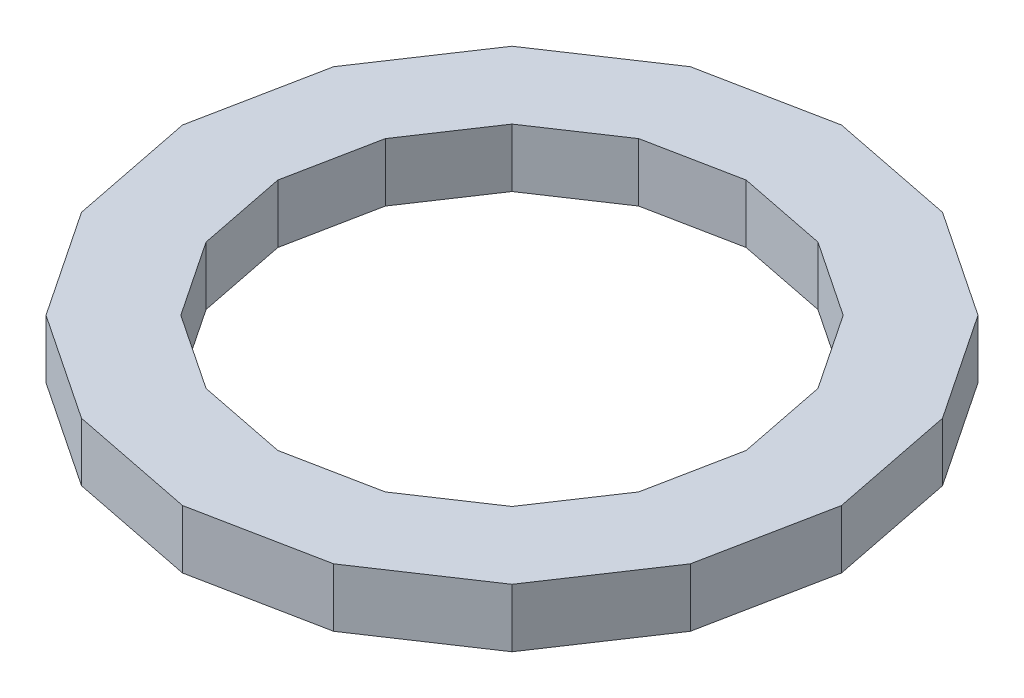
ISO-10303-21;
HEADER;
FILE_DESCRIPTION(('STEP AP214'),'2;1');
FILE_NAME('part.step','',(''),(''),'','','');
FILE_SCHEMA(('AUTOMOTIVE_DESIGN { 1 0 10303 214 1 1 1 1 }'));
ENDSEC;
DATA;
#1=APPLICATION_CONTEXT('core data for automotive mechanical design processes');
#2=APPLICATION_PROTOCOL_DEFINITION('international standard','automotive_design',2000,#1);
#3=PRODUCT_CONTEXT('',#1,'mechanical');
#4=PRODUCT('Part','Part','',(#3));
#5=PRODUCT_RELATED_PRODUCT_CATEGORY('part','',(#4));
#6=PRODUCT_DEFINITION_FORMATION('','',#4);
#7=PRODUCT_DEFINITION_CONTEXT('part definition',#1,'design');
#8=PRODUCT_DEFINITION('design','',#6,#7);
#9=PRODUCT_DEFINITION_SHAPE('','',#8);
#10=(LENGTH_UNIT() NAMED_UNIT(*) SI_UNIT(.MILLI.,.METRE.));
#11=(NAMED_UNIT(*) PLANE_ANGLE_UNIT() SI_UNIT($,.RADIAN.));
#12=(NAMED_UNIT(*) SI_UNIT($,.STERADIAN.) SOLID_ANGLE_UNIT());
#13=UNCERTAINTY_MEASURE_WITH_UNIT(LENGTH_MEASURE(1.E-05),#10,'distance_accuracy_value','');
#14=(GEOMETRIC_REPRESENTATION_CONTEXT(3) GLOBAL_UNCERTAINTY_ASSIGNED_CONTEXT((#13)) GLOBAL_UNIT_ASSIGNED_CONTEXT((#10,
#11,#12)) REPRESENTATION_CONTEXT('',''));
#15=CARTESIAN_POINT('',(0.,0.,0.));
#16=DIRECTION('',(0.,0.,1.));
#17=DIRECTION('',(1.,0.,0.));
#18=AXIS2_PLACEMENT_3D('',#15,#16,#17);
#19=CARTESIAN_POINT('',(0.,19.05,0.));
#20=DIRECTION('',(0.,1.,0.));
#21=DIRECTION('',(0.,0.,1.));
#22=AXIS2_PLACEMENT_3D('',#19,#20,#21);
#23=PLANE('',#22);
#24=DIRECTION('',(0.195090322016117,0.,-0.980785280403233));
#25=VECTOR('',#24,1.);
#26=CARTESIAN_POINT('',(99.2355510191511,19.05,41.1047111016983));
#27=LINE('',#26,#25);
#28=CARTESIAN_POINT('',(99.2355510191511,19.05,41.1047111016983));
#29=VERTEX_POINT('',#28);
#30=CARTESIAN_POINT('',(107.411786414847,19.05,-1.17267698380908E-12));
#31=VERTEX_POINT('',#30);
#32=EDGE_CURVE('E379',#29,#31,#27,.T.);
#33=ORIENTED_EDGE('',*,*,#32,.T.);
#34=DIRECTION('',(-0.195090322016139,0.,-0.980785280403228));
#35=VECTOR('',#34,1.);
#36=CARTESIAN_POINT('',(107.411786414847,19.05,-1.17267698380908E-12));
#37=LINE('',#36,#35);
#38=CARTESIAN_POINT('',(99.2355510191502,19.05,-41.1047111017005));
#39=VERTEX_POINT('',#38);
#40=EDGE_CURVE('E383',#31,#39,#37,.T.);
#41=ORIENTED_EDGE('',*,*,#40,.T.);
#42=DIRECTION('',(-0.555570233019611,0.,-0.831469612302539));
#43=VECTOR('',#42,1.);
#44=CARTESIAN_POINT('',(99.2355510191502,19.05,-41.1047111017005));
#45=LINE('',#44,#43);
#46=CARTESIAN_POINT('',(75.9516025532982,19.05,-75.9516025532999));
#47=VERTEX_POINT('',#46);
#48=EDGE_CURVE('E387',#39,#47,#45,.T.);
#49=ORIENTED_EDGE('',*,*,#48,.T.);
#50=DIRECTION('',(-0.831469612302552,0.,-0.555570233019593));
#51=VECTOR('',#50,1.);
#52=CARTESIAN_POINT('',(75.9516025532982,19.05,-75.9516025532999));
#53=LINE('',#52,#51);
#54=CARTESIAN_POINT('',(41.1047111016984,19.05,-99.235551019151));
#55=VERTEX_POINT('',#54);
#56=EDGE_CURVE('E389',#47,#55,#53,.T.);
#57=ORIENTED_EDGE('',*,*,#56,.T.);
#58=DIRECTION('',(-0.980785280403233,0.,-0.195090322016117));
#59=VECTOR('',#58,1.);
#60=CARTESIAN_POINT('',(41.1047111016984,19.05,-99.235551019151));
#61=LINE('',#60,#59);
#62=CARTESIAN_POINT('',(-1.21550116144787E-12,19.05,-107.411786414846));
#63=VERTEX_POINT('',#62);
#64=EDGE_CURVE('E392',#55,#63,#61,.T.);
#65=ORIENTED_EDGE('',*,*,#64,.T.);
#66=DIRECTION('',(-0.980785280403228,0.,0.195090322016139));
#67=VECTOR('',#66,1.);
#68=CARTESIAN_POINT('',(-1.21550116144787E-12,19.05,-107.411786414846));
#69=LINE('',#68,#67);
#70=CARTESIAN_POINT('',(-41.1047111017005,19.05,-99.2355510191501));
#71=VERTEX_POINT('',#70);
#72=EDGE_CURVE('E394',#63,#71,#69,.T.);
#73=ORIENTED_EDGE('',*,*,#72,.T.);
#74=DIRECTION('',(-0.831469612302539,0.,0.555570233019611));
#75=VECTOR('',#74,1.);
#76=CARTESIAN_POINT('',(-41.1047111017005,19.05,-99.2355510191501));
#77=LINE('',#76,#75);
#78=CARTESIAN_POINT('',(-75.9516025532999,19.05,-75.9516025532982));
#79=VERTEX_POINT('',#78);
#80=EDGE_CURVE('E397',#71,#79,#77,.T.);
#81=ORIENTED_EDGE('',*,*,#80,.T.);
#82=DIRECTION('',(-0.555570233019593,0.,0.831469612302551));
#83=VECTOR('',#82,1.);
#84=CARTESIAN_POINT('',(-75.9516025532999,19.05,-75.9516025532982));
#85=LINE('',#84,#83);
#86=CARTESIAN_POINT('',(-99.235551019151,19.05,-41.1047111016983));
#87=VERTEX_POINT('',#86);
#88=EDGE_CURVE('E400',#79,#87,#85,.T.);
#89=ORIENTED_EDGE('',*,*,#88,.T.);
#90=DIRECTION('',(-0.195090322016117,0.,0.980785280403233));
#91=VECTOR('',#90,1.);
#92=CARTESIAN_POINT('',(-99.235551019151,19.05,-41.1047111016983));
#93=LINE('',#92,#91);
#94=CARTESIAN_POINT('',(-107.411786414846,19.05,1.19130000740411E-12));
#95=VERTEX_POINT('',#94);
#96=EDGE_CURVE('E403',#87,#95,#93,.T.);
#97=ORIENTED_EDGE('',*,*,#96,.T.);
#98=DIRECTION('',(0.195090322016139,0.,0.980785280403228));
#99=VECTOR('',#98,1.);
#100=CARTESIAN_POINT('',(-107.411786414846,19.05,1.19130000740411E-12));
#101=LINE('',#100,#99);
#102=CARTESIAN_POINT('',(-99.2355510191501,19.05,41.1047111017005));
#103=VERTEX_POINT('',#102);
#104=EDGE_CURVE('E406',#95,#103,#101,.T.);
#105=ORIENTED_EDGE('',*,*,#104,.T.);
#106=DIRECTION('',(0.555570233019611,0.,0.831469612302539));
#107=VECTOR('',#106,1.);
#108=CARTESIAN_POINT('',(-99.2355510191501,19.05,41.1047111017005));
#109=LINE('',#108,#107);
#110=CARTESIAN_POINT('',(-75.9516025532982,19.05,75.9516025532999));
#111=VERTEX_POINT('',#110);
#112=EDGE_CURVE('E408',#103,#111,#109,.T.);
#113=ORIENTED_EDGE('',*,*,#112,.T.);
#114=DIRECTION('',(0.831469612302551,0.,0.555570233019593));
#115=VECTOR('',#114,1.);
#116=CARTESIAN_POINT('',(-75.9516025532982,19.05,75.9516025532999));
#117=LINE('',#116,#115);
#118=CARTESIAN_POINT('',(-41.1047111016983,19.05,99.235551019151));
#119=VERTEX_POINT('',#118);
#120=EDGE_CURVE('E410',#111,#119,#117,.T.);
#121=ORIENTED_EDGE('',*,*,#120,.T.);
#122=DIRECTION('',(0.980785280403232,0.,0.195090322016118));
#123=VECTOR('',#122,1.);
#124=CARTESIAN_POINT('',(-41.1047111016983,19.05,99.235551019151));
#125=LINE('',#124,#123);
#126=CARTESIAN_POINT('',(1.18976401131182E-12,19.05,107.411786414847));
#127=VERTEX_POINT('',#126);
#128=EDGE_CURVE('E412',#119,#127,#125,.T.);
#129=ORIENTED_EDGE('',*,*,#128,.T.);
#130=DIRECTION('',(0.980785280403228,0.,-0.195090322016139));
#131=VECTOR('',#130,1.);
#132=CARTESIAN_POINT('',(1.18976401131182E-12,19.05,107.411786414847));
#133=LINE('',#132,#131);
#134=CARTESIAN_POINT('',(41.1047111017005,19.05,99.2355510191502));
#135=VERTEX_POINT('',#134);
#136=EDGE_CURVE('E414',#127,#135,#133,.T.);
#137=ORIENTED_EDGE('',*,*,#136,.T.);
#138=DIRECTION('',(0.831469612302539,0.,-0.555570233019612));
#139=VECTOR('',#138,1.);
#140=CARTESIAN_POINT('',(41.1047111017005,19.05,99.2355510191502));
#141=LINE('',#140,#139);
#142=CARTESIAN_POINT('',(75.9516025532999,19.05,75.9516025532982));
#143=VERTEX_POINT('',#142);
#144=EDGE_CURVE('E416',#135,#143,#141,.T.);
#145=ORIENTED_EDGE('',*,*,#144,.T.);
#146=DIRECTION('',(0.555570233019593,0.,-0.831469612302551));
#147=VECTOR('',#146,1.);
#148=CARTESIAN_POINT('',(75.9516025532999,19.05,75.9516025532982));
#149=LINE('',#148,#147);
#150=EDGE_CURVE('E419',#143,#29,#149,.T.);
#151=ORIENTED_EDGE('',*,*,#150,.T.);
#152=EDGE_LOOP('',(#33,#41,#49,#57,#65,#73,#81,#89,#97,#105,#113,#121,#129,#137,#145,#151));
#153=FACE_BOUND('',#152,.T.);
#154=DIRECTION('',(-0.195090322016139,0.,-0.980785280403228));
#155=VECTOR('',#154,1.);
#156=CARTESIAN_POINT('',(76.334647912657,19.05,-8.61618793245147E-13));
#157=LINE('',#156,#155);
#158=CARTESIAN_POINT('',(76.334647912657,19.05,-8.61618793245147E-13));
#159=VERTEX_POINT('',#158);
#160=CARTESIAN_POINT('',(70.5240188279589,19.05,-29.212005071597));
#161=VERTEX_POINT('',#160);
#162=EDGE_CURVE('E252',#159,#161,#157,.T.);
#163=ORIENTED_EDGE('',*,*,#162,.F.);
#164=DIRECTION('',(0.195090322016117,0.,-0.980785280403233));
#165=VECTOR('',#164,1.);
#166=CARTESIAN_POINT('',(70.5240188279595,19.05,29.2120050715954));
#167=LINE('',#166,#165);
#168=CARTESIAN_POINT('',(70.5240188279595,19.05,29.2120050715954));
#169=VERTEX_POINT('',#168);
#170=EDGE_CURVE('E243',#169,#159,#167,.T.);
#171=ORIENTED_EDGE('',*,*,#170,.F.);
#172=DIRECTION('',(0.555570233019593,0.,-0.831469612302551));
#173=VECTOR('',#172,1.);
#174=CARTESIAN_POINT('',(53.9767471785279,19.05,53.9767471785267));
#175=LINE('',#174,#173);
#176=CARTESIAN_POINT('',(53.9767471785279,19.05,53.9767471785267));
#177=VERTEX_POINT('',#176);
#178=EDGE_CURVE('E301',#177,#169,#175,.T.);
#179=ORIENTED_EDGE('',*,*,#178,.F.);
#180=DIRECTION('',(0.831469612302539,0.,-0.555570233019612));
#181=VECTOR('',#180,1.);
#182=CARTESIAN_POINT('',(29.212005071597,19.05,70.5240188279589));
#183=LINE('',#182,#181);
#184=CARTESIAN_POINT('',(29.212005071597,19.05,70.5240188279589));
#185=VERTEX_POINT('',#184);
#186=EDGE_CURVE('E299',#185,#177,#183,.T.);
#187=ORIENTED_EDGE('',*,*,#186,.F.);
#188=DIRECTION('',(0.980785280403228,0.,-0.195090322016139));
#189=VECTOR('',#188,1.);
#190=CARTESIAN_POINT('',(7.92738908590214E-13,19.05,76.334647912657));
#191=LINE('',#190,#189);
#192=CARTESIAN_POINT('',(7.92738908590214E-13,19.05,76.334647912657));
#193=VERTEX_POINT('',#192);
#194=EDGE_CURVE('E297',#193,#185,#191,.T.);
#195=ORIENTED_EDGE('',*,*,#194,.F.);
#196=DIRECTION('',(0.980785280403233,0.,0.195090322016117));
#197=VECTOR('',#196,1.);
#198=CARTESIAN_POINT('',(-29.2120050715954,19.05,70.5240188279596));
#199=LINE('',#198,#197);
#200=CARTESIAN_POINT('',(-29.2120050715954,19.05,70.5240188279596));
#201=VERTEX_POINT('',#200);
#202=EDGE_CURVE('E295',#201,#193,#199,.T.);
#203=ORIENTED_EDGE('',*,*,#202,.F.);
#204=DIRECTION('',(0.831469612302551,0.,0.555570233019593));
#205=VECTOR('',#204,1.);
#206=CARTESIAN_POINT('',(-53.9767471785267,19.05,53.9767471785279));
#207=LINE('',#206,#205);
#208=CARTESIAN_POINT('',(-53.9767471785267,19.05,53.9767471785279));
#209=VERTEX_POINT('',#208);
#210=EDGE_CURVE('E293',#209,#201,#207,.T.);
#211=ORIENTED_EDGE('',*,*,#210,.F.);
#212=DIRECTION('',(0.555570233019612,0.,0.831469612302539));
#213=VECTOR('',#212,1.);
#214=CARTESIAN_POINT('',(-70.5240188279589,19.05,29.212005071597));
#215=LINE('',#214,#213);
#216=CARTESIAN_POINT('',(-70.5240188279589,19.05,29.212005071597));
#217=VERTEX_POINT('',#216);
#218=EDGE_CURVE('E291',#217,#209,#215,.T.);
#219=ORIENTED_EDGE('',*,*,#218,.F.);
#220=DIRECTION('',(0.195090322016139,0.,0.980785280403228));
#221=VECTOR('',#220,1.);
#222=CARTESIAN_POINT('',(-76.334647912657,19.05,8.32302934409206E-13));
#223=LINE('',#222,#221);
#224=CARTESIAN_POINT('',(-76.334647912657,19.05,8.32302934409206E-13));
#225=VERTEX_POINT('',#224);
#226=EDGE_CURVE('E289',#225,#217,#223,.T.);
#227=ORIENTED_EDGE('',*,*,#226,.F.);
#228=DIRECTION('',(-0.195090322016117,0.,0.980785280403233));
#229=VECTOR('',#228,1.);
#230=CARTESIAN_POINT('',(-70.5240188279595,19.05,-29.2120050715954));
#231=LINE('',#230,#229);
#232=CARTESIAN_POINT('',(-70.5240188279595,19.05,-29.2120050715954));
#233=VERTEX_POINT('',#232);
#234=EDGE_CURVE('E287',#233,#225,#231,.T.);
#235=ORIENTED_EDGE('',*,*,#234,.F.);
#236=DIRECTION('',(-0.555570233019593,0.,0.831469612302551));
#237=VECTOR('',#236,1.);
#238=CARTESIAN_POINT('',(-53.9767471785279,19.05,-53.9767471785267));
#239=LINE('',#238,#237);
#240=CARTESIAN_POINT('',(-53.9767471785279,19.05,-53.9767471785267));
#241=VERTEX_POINT('',#240);
#242=EDGE_CURVE('E284',#241,#233,#239,.T.);
#243=ORIENTED_EDGE('',*,*,#242,.F.);
#244=DIRECTION('',(-0.831469612302539,0.,0.555570233019612));
#245=VECTOR('',#244,1.);
#246=CARTESIAN_POINT('',(-29.212005071597,19.05,-70.5240188279589));
#247=LINE('',#246,#245);
#248=CARTESIAN_POINT('',(-29.212005071597,19.05,-70.5240188279589));
#249=VERTEX_POINT('',#248);
#250=EDGE_CURVE('E281',#249,#241,#247,.T.);
#251=ORIENTED_EDGE('',*,*,#250,.F.);
#252=DIRECTION('',(-0.980785280403228,0.,0.195090322016139));
#253=VECTOR('',#252,1.);
#254=CARTESIAN_POINT('',(-8.94551034685109E-13,19.05,-76.3346479126569));
#255=LINE('',#254,#253);
#256=CARTESIAN_POINT('',(-8.94551034685109E-13,19.05,-76.3346479126569));
#257=VERTEX_POINT('',#256);
#258=EDGE_CURVE('E279',#257,#249,#255,.T.);
#259=ORIENTED_EDGE('',*,*,#258,.F.);
#260=DIRECTION('',(-0.980785280403233,0.,-0.195090322016117));
#261=VECTOR('',#260,1.);
#262=CARTESIAN_POINT('',(29.2120050715955,19.05,-70.5240188279595));
#263=LINE('',#262,#261);
#264=CARTESIAN_POINT('',(29.2120050715955,19.05,-70.5240188279595));
#265=VERTEX_POINT('',#264);
#266=EDGE_CURVE('E276',#265,#257,#263,.T.);
#267=ORIENTED_EDGE('',*,*,#266,.F.);
#268=DIRECTION('',(-0.831469612302552,0.,-0.555570233019593));
#269=VECTOR('',#268,1.);
#270=CARTESIAN_POINT('',(53.9767471785267,19.05,-53.9767471785279));
#271=LINE('',#270,#269);
#272=CARTESIAN_POINT('',(53.9767471785267,19.05,-53.9767471785279));
#273=VERTEX_POINT('',#272);
#274=EDGE_CURVE('E272',#273,#265,#271,.T.);
#275=ORIENTED_EDGE('',*,*,#274,.F.);
#276=DIRECTION('',(-0.555570233019611,0.,-0.831469612302539));
#277=VECTOR('',#276,1.);
#278=CARTESIAN_POINT('',(70.5240188279589,19.05,-29.212005071597));
#279=LINE('',#278,#277);
#280=EDGE_CURVE('E265',#161,#273,#279,.T.);
#281=ORIENTED_EDGE('',*,*,#280,.F.);
#282=EDGE_LOOP('',(#163,#171,#179,#187,#195,#203,#211,#219,#227,#235,#243,#251,#259,#267,#275,#281));
#283=FACE_BOUND('',#282,.T.);
#284=ADVANCED_FACE('F34',(#153,#283),#23,.T.);
#285=CARTESIAN_POINT('',(0.,0.,0.));
#286=DIRECTION('',(0.,1.,0.));
#287=DIRECTION('',(0.,0.,1.));
#288=AXIS2_PLACEMENT_3D('',#285,#286,#287);
#289=PLANE('',#288);
#290=DIRECTION('',(0.195090322016117,0.,-0.980785280403233));
#291=VECTOR('',#290,1.);
#292=CARTESIAN_POINT('',(99.2355510191511,0.,41.1047111016983));
#293=LINE('',#292,#291);
#294=CARTESIAN_POINT('',(99.2355510191511,0.,41.1047111016983));
#295=VERTEX_POINT('',#294);
#296=CARTESIAN_POINT('',(107.411786414847,0.,-1.17267698380908E-12));
#297=VERTEX_POINT('',#296);
#298=EDGE_CURVE('E260',#295,#297,#293,.T.);
#299=ORIENTED_EDGE('',*,*,#298,.F.);
#300=DIRECTION('',(0.555570233019593,0.,-0.831469612302551));
#301=VECTOR('',#300,1.);
#302=CARTESIAN_POINT('',(75.9516025532999,0.,75.9516025532982));
#303=LINE('',#302,#301);
#304=CARTESIAN_POINT('',(75.9516025532999,0.,75.9516025532982));
#305=VERTEX_POINT('',#304);
#306=EDGE_CURVE('E384',#305,#295,#303,.T.);
#307=ORIENTED_EDGE('',*,*,#306,.F.);
#308=DIRECTION('',(0.831469612302539,0.,-0.555570233019612));
#309=VECTOR('',#308,1.);
#310=CARTESIAN_POINT('',(41.1047111017005,0.,99.2355510191502));
#311=LINE('',#310,#309);
#312=CARTESIAN_POINT('',(41.1047111017005,0.,99.2355510191502));
#313=VERTEX_POINT('',#312);
#314=EDGE_CURVE('E455',#313,#305,#311,.T.);
#315=ORIENTED_EDGE('',*,*,#314,.F.);
#316=DIRECTION('',(0.980785280403228,0.,-0.195090322016139));
#317=VECTOR('',#316,1.);
#318=CARTESIAN_POINT('',(1.18976401131182E-12,0.,107.411786414847));
#319=LINE('',#318,#317);
#320=CARTESIAN_POINT('',(1.18976401131182E-12,0.,107.411786414847));
#321=VERTEX_POINT('',#320);
#322=EDGE_CURVE('E453',#321,#313,#319,.T.);
#323=ORIENTED_EDGE('',*,*,#322,.F.);
#324=DIRECTION('',(0.980785280403232,0.,0.195090322016118));
#325=VECTOR('',#324,1.);
#326=CARTESIAN_POINT('',(-41.1047111016983,0.,99.235551019151));
#327=LINE('',#326,#325);
#328=CARTESIAN_POINT('',(-41.1047111016983,0.,99.235551019151));
#329=VERTEX_POINT('',#328);
#330=EDGE_CURVE('E450',#329,#321,#327,.T.);
#331=ORIENTED_EDGE('',*,*,#330,.F.);
#332=DIRECTION('',(0.831469612302551,0.,0.555570233019593));
#333=VECTOR('',#332,1.);
#334=CARTESIAN_POINT('',(-75.9516025532982,0.,75.9516025532999));
#335=LINE('',#334,#333);
#336=CARTESIAN_POINT('',(-75.9516025532982,0.,75.9516025532999));
#337=VERTEX_POINT('',#336);
#338=EDGE_CURVE('E447',#337,#329,#335,.T.);
#339=ORIENTED_EDGE('',*,*,#338,.F.);
#340=DIRECTION('',(0.555570233019611,0.,0.831469612302539));
#341=VECTOR('',#340,1.);
#342=CARTESIAN_POINT('',(-99.2355510191501,0.,41.1047111017005));
#343=LINE('',#342,#341);
#344=CARTESIAN_POINT('',(-99.2355510191501,0.,41.1047111017005));
#345=VERTEX_POINT('',#344);
#346=EDGE_CURVE('E444',#345,#337,#343,.T.);
#347=ORIENTED_EDGE('',*,*,#346,.F.);
#348=DIRECTION('',(0.195090322016139,0.,0.980785280403228));
#349=VECTOR('',#348,1.);
#350=CARTESIAN_POINT('',(-107.411786414846,0.,1.19130000740411E-12));
#351=LINE('',#350,#349);
#352=CARTESIAN_POINT('',(-107.411786414846,0.,1.19130000740411E-12));
#353=VERTEX_POINT('',#352);
#354=EDGE_CURVE('E442',#353,#345,#351,.T.);
#355=ORIENTED_EDGE('',*,*,#354,.F.);
#356=DIRECTION('',(-0.195090322016117,0.,0.980785280403233));
#357=VECTOR('',#356,1.);
#358=CARTESIAN_POINT('',(-99.235551019151,0.,-41.1047111016983));
#359=LINE('',#358,#357);
#360=CARTESIAN_POINT('',(-99.235551019151,0.,-41.1047111016983));
#361=VERTEX_POINT('',#360);
#362=EDGE_CURVE('E440',#361,#353,#359,.T.);
#363=ORIENTED_EDGE('',*,*,#362,.F.);
#364=DIRECTION('',(-0.555570233019593,0.,0.831469612302551));
#365=VECTOR('',#364,1.);
#366=CARTESIAN_POINT('',(-75.9516025532999,0.,-75.9516025532982));
#367=LINE('',#366,#365);
#368=CARTESIAN_POINT('',(-75.9516025532999,0.,-75.9516025532982));
#369=VERTEX_POINT('',#368);
#370=EDGE_CURVE('E437',#369,#361,#367,.T.);
#371=ORIENTED_EDGE('',*,*,#370,.F.);
#372=DIRECTION('',(-0.831469612302539,0.,0.555570233019611));
#373=VECTOR('',#372,1.);
#374=CARTESIAN_POINT('',(-41.1047111017005,0.,-99.2355510191501));
#375=LINE('',#374,#373);
#376=CARTESIAN_POINT('',(-41.1047111017005,0.,-99.2355510191501));
#377=VERTEX_POINT('',#376);
#378=EDGE_CURVE('E435',#377,#369,#375,.T.);
#379=ORIENTED_EDGE('',*,*,#378,.F.);
#380=DIRECTION('',(-0.980785280403228,0.,0.195090322016139));
#381=VECTOR('',#380,1.);
#382=CARTESIAN_POINT('',(-1.21550116144787E-12,0.,-107.411786414846));
#383=LINE('',#382,#381);
#384=CARTESIAN_POINT('',(-1.21550116144787E-12,0.,-107.411786414846));
#385=VERTEX_POINT('',#384);
#386=EDGE_CURVE('E433',#385,#377,#383,.T.);
#387=ORIENTED_EDGE('',*,*,#386,.F.);
#388=DIRECTION('',(-0.980785280403233,0.,-0.195090322016117));
#389=VECTOR('',#388,1.);
#390=CARTESIAN_POINT('',(41.1047111016984,0.,-99.235551019151));
#391=LINE('',#390,#389);
#392=CARTESIAN_POINT('',(41.1047111016984,0.,-99.235551019151));
#393=VERTEX_POINT('',#392);
#394=EDGE_CURVE('E431',#393,#385,#391,.T.);
#395=ORIENTED_EDGE('',*,*,#394,.F.);
#396=DIRECTION('',(-0.831469612302552,0.,-0.555570233019593));
#397=VECTOR('',#396,1.);
#398=CARTESIAN_POINT('',(75.9516025532982,0.,-75.9516025532999));
#399=LINE('',#398,#397);
#400=CARTESIAN_POINT('',(75.9516025532982,0.,-75.9516025532999));
#401=VERTEX_POINT('',#400);
#402=EDGE_CURVE('E429',#401,#393,#399,.T.);
#403=ORIENTED_EDGE('',*,*,#402,.F.);
#404=DIRECTION('',(-0.555570233019611,0.,-0.831469612302539));
#405=VECTOR('',#404,1.);
#406=CARTESIAN_POINT('',(99.2355510191502,0.,-41.1047111017005));
#407=LINE('',#406,#405);
#408=CARTESIAN_POINT('',(99.2355510191502,0.,-41.1047111017005));
#409=VERTEX_POINT('',#408);
#410=EDGE_CURVE('E426',#409,#401,#407,.T.);
#411=ORIENTED_EDGE('',*,*,#410,.F.);
#412=DIRECTION('',(-0.195090322016139,0.,-0.980785280403228));
#413=VECTOR('',#412,1.);
#414=CARTESIAN_POINT('',(107.411786414847,0.,-1.17267698380908E-12));
#415=LINE('',#414,#413);
#416=EDGE_CURVE('E424',#297,#409,#415,.T.);
#417=ORIENTED_EDGE('',*,*,#416,.F.);
#418=EDGE_LOOP('',(#299,#307,#315,#323,#331,#339,#347,#355,#363,#371,#379,#387,#395,#403,#411,#417));
#419=FACE_BOUND('',#418,.T.);
#420=DIRECTION('',(0.195090322016117,0.,-0.980785280403233));
#421=VECTOR('',#420,1.);
#422=CARTESIAN_POINT('',(70.5240188279595,0.,29.2120050715954));
#423=LINE('',#422,#421);
#424=CARTESIAN_POINT('',(70.5240188279595,0.,29.2120050715954));
#425=VERTEX_POINT('',#424);
#426=CARTESIAN_POINT('',(76.334647912657,0.,-8.61618793245147E-13));
#427=VERTEX_POINT('',#426);
#428=EDGE_CURVE('E57',#425,#427,#423,.T.);
#429=ORIENTED_EDGE('',*,*,#428,.T.);
#430=DIRECTION('',(-0.195090322016139,0.,-0.980785280403228));
#431=VECTOR('',#430,1.);
#432=CARTESIAN_POINT('',(76.334647912657,0.,-8.61618793245147E-13));
#433=LINE('',#432,#431);
#434=CARTESIAN_POINT('',(70.5240188279589,0.,-29.212005071597));
#435=VERTEX_POINT('',#434);
#436=EDGE_CURVE('E259',#427,#435,#433,.T.);
#437=ORIENTED_EDGE('',*,*,#436,.T.);
#438=DIRECTION('',(-0.555570233019611,0.,-0.831469612302539));
#439=VECTOR('',#438,1.);
#440=CARTESIAN_POINT('',(70.5240188279589,0.,-29.212005071597));
#441=LINE('',#440,#439);
#442=CARTESIAN_POINT('',(53.9767471785267,0.,-53.9767471785279));
#443=VERTEX_POINT('',#442);
#444=EDGE_CURVE('E307',#435,#443,#441,.T.);
#445=ORIENTED_EDGE('',*,*,#444,.T.);
#446=DIRECTION('',(-0.831469612302552,0.,-0.555570233019593));
#447=VECTOR('',#446,1.);
#448=CARTESIAN_POINT('',(53.9767471785267,0.,-53.9767471785279));
#449=LINE('',#448,#447);
#450=CARTESIAN_POINT('',(29.2120050715955,0.,-70.5240188279595));
#451=VERTEX_POINT('',#450);
#452=EDGE_CURVE('E311',#443,#451,#449,.T.);
#453=ORIENTED_EDGE('',*,*,#452,.T.);
#454=DIRECTION('',(-0.980785280403233,0.,-0.195090322016117));
#455=VECTOR('',#454,1.);
#456=CARTESIAN_POINT('',(29.2120050715955,0.,-70.5240188279595));
#457=LINE('',#456,#455);
#458=CARTESIAN_POINT('',(-8.94551034685109E-13,0.,-76.3346479126569));
#459=VERTEX_POINT('',#458);
#460=EDGE_CURVE('E314',#451,#459,#457,.T.);
#461=ORIENTED_EDGE('',*,*,#460,.T.);
#462=DIRECTION('',(-0.980785280403228,0.,0.195090322016139));
#463=VECTOR('',#462,1.);
#464=CARTESIAN_POINT('',(-8.94551034685109E-13,0.,-76.3346479126569));
#465=LINE('',#464,#463);
#466=CARTESIAN_POINT('',(-29.212005071597,0.,-70.5240188279589));
#467=VERTEX_POINT('',#466);
#468=EDGE_CURVE('E317',#459,#467,#465,.T.);
#469=ORIENTED_EDGE('',*,*,#468,.T.);
#470=DIRECTION('',(-0.831469612302539,0.,0.555570233019612));
#471=VECTOR('',#470,1.);
#472=CARTESIAN_POINT('',(-29.212005071597,0.,-70.5240188279589));
#473=LINE('',#472,#471);
#474=CARTESIAN_POINT('',(-53.9767471785279,0.,-53.9767471785267));
#475=VERTEX_POINT('',#474);
#476=EDGE_CURVE('E320',#467,#475,#473,.T.);
#477=ORIENTED_EDGE('',*,*,#476,.T.);
#478=DIRECTION('',(-0.555570233019593,0.,0.831469612302551));
#479=VECTOR('',#478,1.);
#480=CARTESIAN_POINT('',(-53.9767471785279,0.,-53.9767471785267));
#481=LINE('',#480,#479);
#482=CARTESIAN_POINT('',(-70.5240188279595,0.,-29.2120050715954));
#483=VERTEX_POINT('',#482);
#484=EDGE_CURVE('E323',#475,#483,#481,.T.);
#485=ORIENTED_EDGE('',*,*,#484,.T.);
#486=DIRECTION('',(-0.195090322016117,0.,0.980785280403233));
#487=VECTOR('',#486,1.);
#488=CARTESIAN_POINT('',(-70.5240188279595,0.,-29.2120050715954));
#489=LINE('',#488,#487);
#490=CARTESIAN_POINT('',(-76.334647912657,0.,8.32302934409206E-13));
#491=VERTEX_POINT('',#490);
#492=EDGE_CURVE('E327',#483,#491,#489,.T.);
#493=ORIENTED_EDGE('',*,*,#492,.T.);
#494=DIRECTION('',(0.195090322016139,0.,0.980785280403228));
#495=VECTOR('',#494,1.);
#496=CARTESIAN_POINT('',(-76.334647912657,0.,8.32302934409206E-13));
#497=LINE('',#496,#495);
#498=CARTESIAN_POINT('',(-70.5240188279589,0.,29.212005071597));
#499=VERTEX_POINT('',#498);
#500=EDGE_CURVE('E330',#491,#499,#497,.T.);
#501=ORIENTED_EDGE('',*,*,#500,.T.);
#502=DIRECTION('',(0.555570233019612,0.,0.831469612302539));
#503=VECTOR('',#502,1.);
#504=CARTESIAN_POINT('',(-70.5240188279589,0.,29.212005071597));
#505=LINE('',#504,#503);
#506=CARTESIAN_POINT('',(-53.9767471785267,0.,53.9767471785279));
#507=VERTEX_POINT('',#506);
#508=EDGE_CURVE('E333',#499,#507,#505,.T.);
#509=ORIENTED_EDGE('',*,*,#508,.T.);
#510=DIRECTION('',(0.831469612302551,0.,0.555570233019593));
#511=VECTOR('',#510,1.);
#512=CARTESIAN_POINT('',(-53.9767471785267,0.,53.9767471785279));
#513=LINE('',#512,#511);
#514=CARTESIAN_POINT('',(-29.2120050715954,0.,70.5240188279596));
#515=VERTEX_POINT('',#514);
#516=EDGE_CURVE('E336',#507,#515,#513,.T.);
#517=ORIENTED_EDGE('',*,*,#516,.T.);
#518=DIRECTION('',(0.980785280403233,0.,0.195090322016117));
#519=VECTOR('',#518,1.);
#520=CARTESIAN_POINT('',(-29.2120050715954,0.,70.5240188279596));
#521=LINE('',#520,#519);
#522=CARTESIAN_POINT('',(7.92738908590214E-13,0.,76.334647912657));
#523=VERTEX_POINT('',#522);
#524=EDGE_CURVE('E339',#515,#523,#521,.T.);
#525=ORIENTED_EDGE('',*,*,#524,.T.);
#526=DIRECTION('',(0.980785280403228,0.,-0.195090322016139));
#527=VECTOR('',#526,1.);
#528=CARTESIAN_POINT('',(7.92738908590214E-13,0.,76.334647912657));
#529=LINE('',#528,#527);
#530=CARTESIAN_POINT('',(29.212005071597,0.,70.5240188279589));
#531=VERTEX_POINT('',#530);
#532=EDGE_CURVE('E342',#523,#531,#529,.T.);
#533=ORIENTED_EDGE('',*,*,#532,.T.);
#534=DIRECTION('',(0.831469612302539,0.,-0.555570233019612));
#535=VECTOR('',#534,1.);
#536=CARTESIAN_POINT('',(29.212005071597,0.,70.5240188279589));
#537=LINE('',#536,#535);
#538=CARTESIAN_POINT('',(53.9767471785279,0.,53.9767471785267));
#539=VERTEX_POINT('',#538);
#540=EDGE_CURVE('E345',#531,#539,#537,.T.);
#541=ORIENTED_EDGE('',*,*,#540,.T.);
#542=DIRECTION('',(0.555570233019593,0.,-0.831469612302551));
#543=VECTOR('',#542,1.);
#544=CARTESIAN_POINT('',(53.9767471785279,0.,53.9767471785267));
#545=LINE('',#544,#543);
#546=EDGE_CURVE('E253',#539,#425,#545,.T.);
#547=ORIENTED_EDGE('',*,*,#546,.T.);
#548=EDGE_LOOP('',(#429,#437,#445,#453,#461,#469,#477,#485,#493,#501,#509,#517,#525,#533,#541,#547));
#549=FACE_BOUND('',#548,.T.);
#550=ADVANCED_FACE('F513',(#419,#549),#289,.F.);
#551=CARTESIAN_POINT('',(99.2355510191511,19.05,41.1047111016983));
#552=DIRECTION('',(-0.980785280403233,0.,-0.195090322016117));
#553=DIRECTION('',(-0.195090322016117,0.,0.980785280403233));
#554=AXIS2_PLACEMENT_3D('',#551,#552,#553);
#555=PLANE('',#554);
#556=ORIENTED_EDGE('',*,*,#298,.T.);
#557=DIRECTION('',(0.,-1.,0.));
#558=VECTOR('',#557,1.);
#559=CARTESIAN_POINT('',(107.411786414847,19.05,-1.17267698380908E-12));
#560=LINE('',#559,#558);
#561=EDGE_CURVE('E11',#31,#297,#560,.T.);
#562=ORIENTED_EDGE('',*,*,#561,.F.);
#563=ORIENTED_EDGE('',*,*,#32,.F.);
#564=DIRECTION('',(0.,-1.,0.));
#565=VECTOR('',#564,1.);
#566=CARTESIAN_POINT('',(99.2355510191511,19.05,41.1047111016983));
#567=LINE('',#566,#565);
#568=EDGE_CURVE('E421',#29,#295,#567,.T.);
#569=ORIENTED_EDGE('',*,*,#568,.T.);
#570=EDGE_LOOP('',(#556,#562,#563,#569));
#571=FACE_BOUND('',#570,.T.);
#572=ADVANCED_FACE('F36',(#571),#555,.F.);
#573=CARTESIAN_POINT('',(107.411786414847,19.05,-1.17267698380908E-12));
#574=DIRECTION('',(-0.980785280403228,0.,0.195090322016139));
#575=DIRECTION('',(0.195090322016139,0.,0.980785280403228));
#576=AXIS2_PLACEMENT_3D('',#573,#574,#575);
#577=PLANE('',#576);
#578=ORIENTED_EDGE('',*,*,#416,.T.);
#579=DIRECTION('',(0.,-1.,0.));
#580=VECTOR('',#579,1.);
#581=CARTESIAN_POINT('',(99.2355510191502,19.05,-41.1047111017005));
#582=LINE('',#581,#580);
#583=EDGE_CURVE('E42',#39,#409,#582,.T.);
#584=ORIENTED_EDGE('',*,*,#583,.F.);
#585=ORIENTED_EDGE('',*,*,#40,.F.);
#586=ORIENTED_EDGE('',*,*,#561,.T.);
#587=EDGE_LOOP('',(#578,#584,#585,#586));
#588=FACE_BOUND('',#587,.T.);
#589=ADVANCED_FACE('F530',(#588),#577,.F.);
#590=CARTESIAN_POINT('',(99.2355510191502,19.05,-41.1047111017005));
#591=DIRECTION('',(-0.831469612302539,0.,0.555570233019611));
#592=DIRECTION('',(0.555570233019611,0.,0.831469612302539));
#593=AXIS2_PLACEMENT_3D('',#590,#591,#592);
#594=PLANE('',#593);
#595=ORIENTED_EDGE('',*,*,#410,.T.);
#596=DIRECTION('',(0.,-1.,0.));
#597=VECTOR('',#596,1.);
#598=CARTESIAN_POINT('',(75.9516025532982,19.05,-75.9516025532999));
#599=LINE('',#598,#597);
#600=EDGE_CURVE('E500',#47,#401,#599,.T.);
#601=ORIENTED_EDGE('',*,*,#600,.F.);
#602=ORIENTED_EDGE('',*,*,#48,.F.);
#603=ORIENTED_EDGE('',*,*,#583,.T.);
#604=EDGE_LOOP('',(#595,#601,#602,#603));
#605=FACE_BOUND('',#604,.T.);
#606=ADVANCED_FACE('F507',(#605),#594,.F.);
#607=CARTESIAN_POINT('',(75.9516025532982,19.05,-75.9516025532999));
#608=DIRECTION('',(-0.555570233019593,0.,0.831469612302551));
#609=DIRECTION('',(0.831469612302551,0.,0.555570233019593));
#610=AXIS2_PLACEMENT_3D('',#607,#608,#609);
#611=PLANE('',#610);
#612=ORIENTED_EDGE('',*,*,#402,.T.);
#613=DIRECTION('',(0.,-1.,0.));
#614=VECTOR('',#613,1.);
#615=CARTESIAN_POINT('',(41.1047111016984,19.05,-99.235551019151));
#616=LINE('',#615,#614);
#617=EDGE_CURVE('E497',#55,#393,#616,.T.);
#618=ORIENTED_EDGE('',*,*,#617,.F.);
#619=ORIENTED_EDGE('',*,*,#56,.F.);
#620=ORIENTED_EDGE('',*,*,#600,.T.);
#621=EDGE_LOOP('',(#612,#618,#619,#620));
#622=FACE_BOUND('',#621,.T.);
#623=ADVANCED_FACE('F519',(#622),#611,.F.);
#624=CARTESIAN_POINT('',(41.1047111016984,19.05,-99.235551019151));
#625=DIRECTION('',(-0.195090322016117,0.,0.980785280403233));
#626=DIRECTION('',(0.980785280403233,0.,0.195090322016117));
#627=AXIS2_PLACEMENT_3D('',#624,#625,#626);
#628=PLANE('',#627);
#629=ORIENTED_EDGE('',*,*,#394,.T.);
#630=DIRECTION('',(0.,-1.,0.));
#631=VECTOR('',#630,1.);
#632=CARTESIAN_POINT('',(-1.21550116144787E-12,19.05,-107.411786414846));
#633=LINE('',#632,#631);
#634=EDGE_CURVE('E493',#63,#385,#633,.T.);
#635=ORIENTED_EDGE('',*,*,#634,.F.);
#636=ORIENTED_EDGE('',*,*,#64,.F.);
#637=ORIENTED_EDGE('',*,*,#617,.T.);
#638=EDGE_LOOP('',(#629,#635,#636,#637));
#639=FACE_BOUND('',#638,.T.);
#640=ADVANCED_FACE('F523',(#639),#628,.F.);
#641=CARTESIAN_POINT('',(-1.21550116144787E-12,19.05,-107.411786414846));
#642=DIRECTION('',(0.195090322016139,0.,0.980785280403228));
#643=DIRECTION('',(0.980785280403228,0.,-0.195090322016139));
#644=AXIS2_PLACEMENT_3D('',#641,#642,#643);
#645=PLANE('',#644);
#646=ORIENTED_EDGE('',*,*,#386,.T.);
#647=DIRECTION('',(0.,-1.,0.));
#648=VECTOR('',#647,1.);
#649=CARTESIAN_POINT('',(-41.1047111017005,19.05,-99.2355510191501));
#650=LINE('',#649,#648);
#651=EDGE_CURVE('E489',#71,#377,#650,.T.);
#652=ORIENTED_EDGE('',*,*,#651,.F.);
#653=ORIENTED_EDGE('',*,*,#72,.F.);
#654=ORIENTED_EDGE('',*,*,#634,.T.);
#655=EDGE_LOOP('',(#646,#652,#653,#654));
#656=FACE_BOUND('',#655,.T.);
#657=ADVANCED_FACE('F583',(#656),#645,.F.);
#658=CARTESIAN_POINT('',(-41.1047111017005,19.05,-99.2355510191501));
#659=DIRECTION('',(0.555570233019611,0.,0.831469612302539));
#660=DIRECTION('',(0.831469612302539,0.,-0.555570233019611));
#661=AXIS2_PLACEMENT_3D('',#658,#659,#660);
#662=PLANE('',#661);
#663=ORIENTED_EDGE('',*,*,#378,.T.);
#664=DIRECTION('',(0.,-1.,0.));
#665=VECTOR('',#664,1.);
#666=CARTESIAN_POINT('',(-75.9516025532999,19.05,-75.9516025532982));
#667=LINE('',#666,#665);
#668=EDGE_CURVE('E486',#79,#369,#667,.T.);
#669=ORIENTED_EDGE('',*,*,#668,.F.);
#670=ORIENTED_EDGE('',*,*,#80,.F.);
#671=ORIENTED_EDGE('',*,*,#651,.T.);
#672=EDGE_LOOP('',(#663,#669,#670,#671));
#673=FACE_BOUND('',#672,.T.);
#674=ADVANCED_FACE('F580',(#673),#662,.F.);
#675=CARTESIAN_POINT('',(-75.9516025532999,19.05,-75.9516025532982));
#676=DIRECTION('',(0.831469612302551,0.,0.555570233019593));
#677=DIRECTION('',(0.555570233019593,0.,-0.831469612302551));
#678=AXIS2_PLACEMENT_3D('',#675,#676,#677);
#679=PLANE('',#678);
#680=ORIENTED_EDGE('',*,*,#370,.T.);
#681=DIRECTION('',(0.,-1.,0.));
#682=VECTOR('',#681,1.);
#683=CARTESIAN_POINT('',(-99.235551019151,19.05,-41.1047111016983));
#684=LINE('',#683,#682);
#685=EDGE_CURVE('E482',#87,#361,#684,.T.);
#686=ORIENTED_EDGE('',*,*,#685,.F.);
#687=ORIENTED_EDGE('',*,*,#88,.F.);
#688=ORIENTED_EDGE('',*,*,#668,.T.);
#689=EDGE_LOOP('',(#680,#686,#687,#688));
#690=FACE_BOUND('',#689,.T.);
#691=ADVANCED_FACE('F576',(#690),#679,.F.);
#692=CARTESIAN_POINT('',(-99.235551019151,19.05,-41.1047111016983));
#693=DIRECTION('',(0.980785280403233,0.,0.195090322016117));
#694=DIRECTION('',(0.195090322016117,0.,-0.980785280403233));
#695=AXIS2_PLACEMENT_3D('',#692,#693,#694);
#696=PLANE('',#695);
#697=ORIENTED_EDGE('',*,*,#362,.T.);
#698=DIRECTION('',(0.,-1.,0.));
#699=VECTOR('',#698,1.);
#700=CARTESIAN_POINT('',(-107.411786414846,19.05,1.19130000740411E-12));
#701=LINE('',#700,#699);
#702=EDGE_CURVE('E479',#95,#353,#701,.T.);
#703=ORIENTED_EDGE('',*,*,#702,.F.);
#704=ORIENTED_EDGE('',*,*,#96,.F.);
#705=ORIENTED_EDGE('',*,*,#685,.T.);
#706=EDGE_LOOP('',(#697,#703,#704,#705));
#707=FACE_BOUND('',#706,.T.);
#708=ADVANCED_FACE('F572',(#707),#696,.F.);
#709=CARTESIAN_POINT('',(-107.411786414846,19.05,1.19130000740411E-12));
#710=DIRECTION('',(0.980785280403228,0.,-0.195090322016139));
#711=DIRECTION('',(-0.195090322016139,0.,-0.980785280403228));
#712=AXIS2_PLACEMENT_3D('',#709,#710,#711);
#713=PLANE('',#712);
#714=ORIENTED_EDGE('',*,*,#354,.T.);
#715=DIRECTION('',(0.,-1.,0.));
#716=VECTOR('',#715,1.);
#717=CARTESIAN_POINT('',(-99.2355510191501,19.05,41.1047111017005));
#718=LINE('',#717,#716);
#719=EDGE_CURVE('E476',#103,#345,#718,.T.);
#720=ORIENTED_EDGE('',*,*,#719,.F.);
#721=ORIENTED_EDGE('',*,*,#104,.F.);
#722=ORIENTED_EDGE('',*,*,#702,.T.);
#723=EDGE_LOOP('',(#714,#720,#721,#722));
#724=FACE_BOUND('',#723,.T.);
#725=ADVANCED_FACE('F567',(#724),#713,.F.);
#726=CARTESIAN_POINT('',(-99.2355510191501,19.05,41.1047111017005));
#727=DIRECTION('',(0.831469612302539,0.,-0.555570233019612));
#728=DIRECTION('',(-0.555570233019612,0.,-0.831469612302539));
#729=AXIS2_PLACEMENT_3D('',#726,#727,#728);
#730=PLANE('',#729);
#731=ORIENTED_EDGE('',*,*,#346,.T.);
#732=DIRECTION('',(0.,-1.,0.));
#733=VECTOR('',#732,1.);
#734=CARTESIAN_POINT('',(-75.9516025532982,19.05,75.9516025532999));
#735=LINE('',#734,#733);
#736=EDGE_CURVE('E473',#111,#337,#735,.T.);
#737=ORIENTED_EDGE('',*,*,#736,.F.);
#738=ORIENTED_EDGE('',*,*,#112,.F.);
#739=ORIENTED_EDGE('',*,*,#719,.T.);
#740=EDGE_LOOP('',(#731,#737,#738,#739));
#741=FACE_BOUND('',#740,.T.);
#742=ADVANCED_FACE('F561',(#741),#730,.F.);
#743=CARTESIAN_POINT('',(-75.9516025532982,19.05,75.9516025532999));
#744=DIRECTION('',(0.555570233019593,0.,-0.831469612302551));
#745=DIRECTION('',(-0.831469612302551,0.,-0.555570233019593));
#746=AXIS2_PLACEMENT_3D('',#743,#744,#745);
#747=PLANE('',#746);
#748=ORIENTED_EDGE('',*,*,#338,.T.);
#749=DIRECTION('',(0.,-1.,0.));
#750=VECTOR('',#749,1.);
#751=CARTESIAN_POINT('',(-41.1047111016983,19.05,99.235551019151));
#752=LINE('',#751,#750);
#753=EDGE_CURVE('E470',#119,#329,#752,.T.);
#754=ORIENTED_EDGE('',*,*,#753,.F.);
#755=ORIENTED_EDGE('',*,*,#120,.F.);
#756=ORIENTED_EDGE('',*,*,#736,.T.);
#757=EDGE_LOOP('',(#748,#754,#755,#756));
#758=FACE_BOUND('',#757,.T.);
#759=ADVANCED_FACE('F557',(#758),#747,.F.);
#760=CARTESIAN_POINT('',(-41.1047111016983,19.05,99.235551019151));
#761=DIRECTION('',(0.195090322016118,0.,-0.980785280403233));
#762=DIRECTION('',(-0.980785280403233,0.,-0.195090322016118));
#763=AXIS2_PLACEMENT_3D('',#760,#761,#762);
#764=PLANE('',#763);
#765=ORIENTED_EDGE('',*,*,#330,.T.);
#766=DIRECTION('',(0.,-1.,0.));
#767=VECTOR('',#766,1.);
#768=CARTESIAN_POINT('',(1.18976401131182E-12,19.05,107.411786414847));
#769=LINE('',#768,#767);
#770=EDGE_CURVE('E467',#127,#321,#769,.T.);
#771=ORIENTED_EDGE('',*,*,#770,.F.);
#772=ORIENTED_EDGE('',*,*,#128,.F.);
#773=ORIENTED_EDGE('',*,*,#753,.T.);
#774=EDGE_LOOP('',(#765,#771,#772,#773));
#775=FACE_BOUND('',#774,.T.);
#776=ADVANCED_FACE('F552',(#775),#764,.F.);
#777=CARTESIAN_POINT('',(1.18976401131182E-12,19.05,107.411786414847));
#778=DIRECTION('',(-0.195090322016139,0.,-0.980785280403228));
#779=DIRECTION('',(-0.980785280403228,0.,0.195090322016139));
#780=AXIS2_PLACEMENT_3D('',#777,#778,#779);
#781=PLANE('',#780);
#782=ORIENTED_EDGE('',*,*,#322,.T.);
#783=DIRECTION('',(0.,-1.,0.));
#784=VECTOR('',#783,1.);
#785=CARTESIAN_POINT('',(41.1047111017005,19.05,99.2355510191502));
#786=LINE('',#785,#784);
#787=EDGE_CURVE('E464',#135,#313,#786,.T.);
#788=ORIENTED_EDGE('',*,*,#787,.F.);
#789=ORIENTED_EDGE('',*,*,#136,.F.);
#790=ORIENTED_EDGE('',*,*,#770,.T.);
#791=EDGE_LOOP('',(#782,#788,#789,#790));
#792=FACE_BOUND('',#791,.T.);
#793=ADVANCED_FACE('F546',(#792),#781,.F.);
#794=CARTESIAN_POINT('',(41.1047111017005,19.05,99.2355510191502));
#795=DIRECTION('',(-0.555570233019612,0.,-0.831469612302539));
#796=DIRECTION('',(-0.831469612302539,0.,0.555570233019612));
#797=AXIS2_PLACEMENT_3D('',#794,#795,#796);
#798=PLANE('',#797);
#799=ORIENTED_EDGE('',*,*,#314,.T.);
#800=DIRECTION('',(0.,-1.,0.));
#801=VECTOR('',#800,1.);
#802=CARTESIAN_POINT('',(75.9516025532999,19.05,75.9516025532982));
#803=LINE('',#802,#801);
#804=EDGE_CURVE('E461',#143,#305,#803,.T.);
#805=ORIENTED_EDGE('',*,*,#804,.F.);
#806=ORIENTED_EDGE('',*,*,#144,.F.);
#807=ORIENTED_EDGE('',*,*,#787,.T.);
#808=EDGE_LOOP('',(#799,#805,#806,#807));
#809=FACE_BOUND('',#808,.T.);
#810=ADVANCED_FACE('F542',(#809),#798,.F.);
#811=CARTESIAN_POINT('',(75.9516025532999,19.05,75.9516025532982));
#812=DIRECTION('',(-0.831469612302551,0.,-0.555570233019593));
#813=DIRECTION('',(-0.555570233019593,0.,0.831469612302551));
#814=AXIS2_PLACEMENT_3D('',#811,#812,#813);
#815=PLANE('',#814);
#816=ORIENTED_EDGE('',*,*,#306,.T.);
#817=ORIENTED_EDGE('',*,*,#568,.F.);
#818=ORIENTED_EDGE('',*,*,#150,.F.);
#819=ORIENTED_EDGE('',*,*,#804,.T.);
#820=EDGE_LOOP('',(#816,#817,#818,#819));
#821=FACE_BOUND('',#820,.T.);
#822=ADVANCED_FACE('F537',(#821),#815,.F.);
#823=CARTESIAN_POINT('',(70.5240188279595,19.05,29.2120050715954));
#824=DIRECTION('',(-0.980785280403233,0.,-0.195090322016117));
#825=DIRECTION('',(-0.195090322016118,0.,0.980785280403233));
#826=AXIS2_PLACEMENT_3D('',#823,#824,#825);
#827=PLANE('',#826);
#828=ORIENTED_EDGE('',*,*,#428,.F.);
#829=DIRECTION('',(0.,-1.,0.));
#830=VECTOR('',#829,1.);
#831=CARTESIAN_POINT('',(70.5240188279595,19.05,29.2120050715954));
#832=LINE('',#831,#830);
#833=EDGE_CURVE('E247',#169,#425,#832,.T.);
#834=ORIENTED_EDGE('',*,*,#833,.F.);
#835=ORIENTED_EDGE('',*,*,#170,.T.);
#836=DIRECTION('',(0.,-1.,0.));
#837=VECTOR('',#836,1.);
#838=CARTESIAN_POINT('',(76.334647912657,19.05,-8.61618793245147E-13));
#839=LINE('',#838,#837);
#840=EDGE_CURVE('E246',#159,#427,#839,.T.);
#841=ORIENTED_EDGE('',*,*,#840,.T.);
#842=EDGE_LOOP('',(#828,#834,#835,#841));
#843=FACE_BOUND('',#842,.T.);
#844=ADVANCED_FACE('F245',(#843),#827,.T.);
#845=CARTESIAN_POINT('',(76.334647912657,19.05,-8.61618793245147E-13));
#846=DIRECTION('',(-0.980785280403228,0.,0.195090322016139));
#847=DIRECTION('',(0.195090322016139,0.,0.980785280403228));
#848=AXIS2_PLACEMENT_3D('',#845,#846,#847);
#849=PLANE('',#848);
#850=ORIENTED_EDGE('',*,*,#436,.F.);
#851=ORIENTED_EDGE('',*,*,#840,.F.);
#852=ORIENTED_EDGE('',*,*,#162,.T.);
#853=DIRECTION('',(0.,-1.,0.));
#854=VECTOR('',#853,1.);
#855=CARTESIAN_POINT('',(70.5240188279589,19.05,-29.212005071597));
#856=LINE('',#855,#854);
#857=EDGE_CURVE('E261',#161,#435,#856,.T.);
#858=ORIENTED_EDGE('',*,*,#857,.T.);
#859=EDGE_LOOP('',(#850,#851,#852,#858));
#860=FACE_BOUND('',#859,.T.);
#861=ADVANCED_FACE('F256',(#860),#849,.T.);
#862=CARTESIAN_POINT('',(70.5240188279589,19.05,-29.212005071597));
#863=DIRECTION('',(-0.831469612302539,0.,0.555570233019611));
#864=DIRECTION('',(0.555570233019612,0.,0.831469612302539));
#865=AXIS2_PLACEMENT_3D('',#862,#863,#864);
#866=PLANE('',#865);
#867=ORIENTED_EDGE('',*,*,#444,.F.);
#868=ORIENTED_EDGE('',*,*,#857,.F.);
#869=ORIENTED_EDGE('',*,*,#280,.T.);
#870=DIRECTION('',(0.,-1.,0.));
#871=VECTOR('',#870,1.);
#872=CARTESIAN_POINT('',(53.9767471785267,19.05,-53.9767471785279));
#873=LINE('',#872,#871);
#874=EDGE_CURVE('E374',#273,#443,#873,.T.);
#875=ORIENTED_EDGE('',*,*,#874,.T.);
#876=EDGE_LOOP('',(#867,#868,#869,#875));
#877=FACE_BOUND('',#876,.T.);
#878=ADVANCED_FACE('F665',(#877),#866,.T.);
#879=CARTESIAN_POINT('',(53.9767471785267,19.05,-53.9767471785279));
#880=DIRECTION('',(-0.555570233019593,0.,0.831469612302552));
#881=DIRECTION('',(0.831469612302552,0.,0.555570233019593));
#882=AXIS2_PLACEMENT_3D('',#879,#880,#881);
#883=PLANE('',#882);
#884=ORIENTED_EDGE('',*,*,#452,.F.);
#885=ORIENTED_EDGE('',*,*,#874,.F.);
#886=ORIENTED_EDGE('',*,*,#274,.T.);
#887=DIRECTION('',(0.,-1.,0.));
#888=VECTOR('',#887,1.);
#889=CARTESIAN_POINT('',(29.2120050715955,19.05,-70.5240188279595));
#890=LINE('',#889,#888);
#891=EDGE_CURVE('E372',#265,#451,#890,.T.);
#892=ORIENTED_EDGE('',*,*,#891,.T.);
#893=EDGE_LOOP('',(#884,#885,#886,#892));
#894=FACE_BOUND('',#893,.T.);
#895=ADVANCED_FACE('F671',(#894),#883,.T.);
#896=CARTESIAN_POINT('',(29.2120050715955,19.05,-70.5240188279595));
#897=DIRECTION('',(-0.195090322016117,0.,0.980785280403233));
#898=DIRECTION('',(0.980785280403233,0.,0.195090322016117));
#899=AXIS2_PLACEMENT_3D('',#896,#897,#898);
#900=PLANE('',#899);
#901=ORIENTED_EDGE('',*,*,#460,.F.);
#902=ORIENTED_EDGE('',*,*,#891,.F.);
#903=ORIENTED_EDGE('',*,*,#266,.T.);
#904=DIRECTION('',(0.,-1.,0.));
#905=VECTOR('',#904,1.);
#906=CARTESIAN_POINT('',(-8.94551034685109E-13,19.05,-76.3346479126569));
#907=LINE('',#906,#905);
#908=EDGE_CURVE('E370',#257,#459,#907,.T.);
#909=ORIENTED_EDGE('',*,*,#908,.T.);
#910=EDGE_LOOP('',(#901,#902,#903,#909));
#911=FACE_BOUND('',#910,.T.);
#912=ADVANCED_FACE('F679',(#911),#900,.T.);
#913=CARTESIAN_POINT('',(-8.94551034685109E-13,19.05,-76.3346479126569));
#914=DIRECTION('',(0.195090322016139,0.,0.980785280403228));
#915=DIRECTION('',(0.980785280403229,0.,-0.195090322016139));
#916=AXIS2_PLACEMENT_3D('',#913,#914,#915);
#917=PLANE('',#916);
#918=ORIENTED_EDGE('',*,*,#468,.F.);
#919=ORIENTED_EDGE('',*,*,#908,.F.);
#920=ORIENTED_EDGE('',*,*,#258,.T.);
#921=DIRECTION('',(0.,-1.,0.));
#922=VECTOR('',#921,1.);
#923=CARTESIAN_POINT('',(-29.212005071597,19.05,-70.5240188279589));
#924=LINE('',#923,#922);
#925=EDGE_CURVE('E368',#249,#467,#924,.T.);
#926=ORIENTED_EDGE('',*,*,#925,.T.);
#927=EDGE_LOOP('',(#918,#919,#920,#926));
#928=FACE_BOUND('',#927,.T.);
#929=ADVANCED_FACE('F687',(#928),#917,.T.);
#930=CARTESIAN_POINT('',(-29.212005071597,19.05,-70.5240188279589));
#931=DIRECTION('',(0.555570233019612,0.,0.831469612302539));
#932=DIRECTION('',(0.831469612302539,0.,-0.555570233019612));
#933=AXIS2_PLACEMENT_3D('',#930,#931,#932);
#934=PLANE('',#933);
#935=ORIENTED_EDGE('',*,*,#476,.F.);
#936=ORIENTED_EDGE('',*,*,#925,.F.);
#937=ORIENTED_EDGE('',*,*,#250,.T.);
#938=DIRECTION('',(0.,-1.,0.));
#939=VECTOR('',#938,1.);
#940=CARTESIAN_POINT('',(-53.9767471785279,19.05,-53.9767471785267));
#941=LINE('',#940,#939);
#942=EDGE_CURVE('E366',#241,#475,#941,.T.);
#943=ORIENTED_EDGE('',*,*,#942,.T.);
#944=EDGE_LOOP('',(#935,#936,#937,#943));
#945=FACE_BOUND('',#944,.T.);
#946=ADVANCED_FACE('F695',(#945),#934,.T.);
#947=CARTESIAN_POINT('',(-53.9767471785279,19.05,-53.9767471785267));
#948=DIRECTION('',(0.831469612302552,0.,0.555570233019593));
#949=DIRECTION('',(0.555570233019593,0.,-0.831469612302552));
#950=AXIS2_PLACEMENT_3D('',#947,#948,#949);
#951=PLANE('',#950);
#952=ORIENTED_EDGE('',*,*,#484,.F.);
#953=ORIENTED_EDGE('',*,*,#942,.F.);
#954=ORIENTED_EDGE('',*,*,#242,.T.);
#955=DIRECTION('',(0.,-1.,0.));
#956=VECTOR('',#955,1.);
#957=CARTESIAN_POINT('',(-70.5240188279595,19.05,-29.2120050715954));
#958=LINE('',#957,#956);
#959=EDGE_CURVE('E364',#233,#483,#958,.T.);
#960=ORIENTED_EDGE('',*,*,#959,.T.);
#961=EDGE_LOOP('',(#952,#953,#954,#960));
#962=FACE_BOUND('',#961,.T.);
#963=ADVANCED_FACE('F703',(#962),#951,.T.);
#964=CARTESIAN_POINT('',(-70.5240188279595,19.05,-29.2120050715954));
#965=DIRECTION('',(0.980785280403233,0.,0.195090322016117));
#966=DIRECTION('',(0.195090322016117,0.,-0.980785280403233));
#967=AXIS2_PLACEMENT_3D('',#964,#965,#966);
#968=PLANE('',#967);
#969=ORIENTED_EDGE('',*,*,#492,.F.);
#970=ORIENTED_EDGE('',*,*,#959,.F.);
#971=ORIENTED_EDGE('',*,*,#234,.T.);
#972=DIRECTION('',(0.,-1.,0.));
#973=VECTOR('',#972,1.);
#974=CARTESIAN_POINT('',(-76.334647912657,19.05,8.32302934409206E-13));
#975=LINE('',#974,#973);
#976=EDGE_CURVE('E362',#225,#491,#975,.T.);
#977=ORIENTED_EDGE('',*,*,#976,.T.);
#978=EDGE_LOOP('',(#969,#970,#971,#977));
#979=FACE_BOUND('',#978,.T.);
#980=ADVANCED_FACE('F711',(#979),#968,.T.);
#981=CARTESIAN_POINT('',(-76.334647912657,19.05,8.32302934409206E-13));
#982=DIRECTION('',(0.980785280403228,0.,-0.195090322016139));
#983=DIRECTION('',(-0.195090322016139,0.,-0.980785280403228));
#984=AXIS2_PLACEMENT_3D('',#981,#982,#983);
#985=PLANE('',#984);
#986=ORIENTED_EDGE('',*,*,#500,.F.);
#987=ORIENTED_EDGE('',*,*,#976,.F.);
#988=ORIENTED_EDGE('',*,*,#226,.T.);
#989=DIRECTION('',(0.,-1.,0.));
#990=VECTOR('',#989,1.);
#991=CARTESIAN_POINT('',(-70.5240188279589,19.05,29.212005071597));
#992=LINE('',#991,#990);
#993=EDGE_CURVE('E360',#217,#499,#992,.T.);
#994=ORIENTED_EDGE('',*,*,#993,.T.);
#995=EDGE_LOOP('',(#986,#987,#988,#994));
#996=FACE_BOUND('',#995,.T.);
#997=ADVANCED_FACE('F719',(#996),#985,.T.);
#998=CARTESIAN_POINT('',(-70.5240188279589,19.05,29.212005071597));
#999=DIRECTION('',(0.831469612302539,0.,-0.555570233019612));
#1000=DIRECTION('',(-0.555570233019612,0.,-0.831469612302539));
#1001=AXIS2_PLACEMENT_3D('',#998,#999,#1000);
#1002=PLANE('',#1001);
#1003=ORIENTED_EDGE('',*,*,#508,.F.);
#1004=ORIENTED_EDGE('',*,*,#993,.F.);
#1005=ORIENTED_EDGE('',*,*,#218,.T.);
#1006=DIRECTION('',(0.,-1.,0.));
#1007=VECTOR('',#1006,1.);
#1008=CARTESIAN_POINT('',(-53.9767471785267,19.05,53.9767471785279));
#1009=LINE('',#1008,#1007);
#1010=EDGE_CURVE('E358',#209,#507,#1009,.T.);
#1011=ORIENTED_EDGE('',*,*,#1010,.T.);
#1012=EDGE_LOOP('',(#1003,#1004,#1005,#1011));
#1013=FACE_BOUND('',#1012,.T.);
#1014=ADVANCED_FACE('F727',(#1013),#1002,.T.);
#1015=CARTESIAN_POINT('',(-53.9767471785267,19.05,53.9767471785279));
#1016=DIRECTION('',(0.555570233019593,0.,-0.831469612302551));
#1017=DIRECTION('',(-0.831469612302551,0.,-0.555570233019593));
#1018=AXIS2_PLACEMENT_3D('',#1015,#1016,#1017);
#1019=PLANE('',#1018);
#1020=ORIENTED_EDGE('',*,*,#516,.F.);
#1021=ORIENTED_EDGE('',*,*,#1010,.F.);
#1022=ORIENTED_EDGE('',*,*,#210,.T.);
#1023=DIRECTION('',(0.,-1.,0.));
#1024=VECTOR('',#1023,1.);
#1025=CARTESIAN_POINT('',(-29.2120050715954,19.05,70.5240188279596));
#1026=LINE('',#1025,#1024);
#1027=EDGE_CURVE('E356',#201,#515,#1026,.T.);
#1028=ORIENTED_EDGE('',*,*,#1027,.T.);
#1029=EDGE_LOOP('',(#1020,#1021,#1022,#1028));
#1030=FACE_BOUND('',#1029,.T.);
#1031=ADVANCED_FACE('F735',(#1030),#1019,.T.);
#1032=CARTESIAN_POINT('',(-29.2120050715954,19.05,70.5240188279596));
#1033=DIRECTION('',(0.195090322016117,0.,-0.980785280403233));
#1034=DIRECTION('',(-0.980785280403233,0.,-0.195090322016117));
#1035=AXIS2_PLACEMENT_3D('',#1032,#1033,#1034);
#1036=PLANE('',#1035);
#1037=ORIENTED_EDGE('',*,*,#524,.F.);
#1038=ORIENTED_EDGE('',*,*,#1027,.F.);
#1039=ORIENTED_EDGE('',*,*,#202,.T.);
#1040=DIRECTION('',(0.,-1.,0.));
#1041=VECTOR('',#1040,1.);
#1042=CARTESIAN_POINT('',(7.92738908590214E-13,19.05,76.334647912657));
#1043=LINE('',#1042,#1041);
#1044=EDGE_CURVE('E354',#193,#523,#1043,.T.);
#1045=ORIENTED_EDGE('',*,*,#1044,.T.);
#1046=EDGE_LOOP('',(#1037,#1038,#1039,#1045));
#1047=FACE_BOUND('',#1046,.T.);
#1048=ADVANCED_FACE('F743',(#1047),#1036,.T.);
#1049=CARTESIAN_POINT('',(7.92738908590214E-13,19.05,76.334647912657));
#1050=DIRECTION('',(-0.195090322016139,0.,-0.980785280403228));
#1051=DIRECTION('',(-0.980785280403228,0.,0.195090322016139));
#1052=AXIS2_PLACEMENT_3D('',#1049,#1050,#1051);
#1053=PLANE('',#1052);
#1054=ORIENTED_EDGE('',*,*,#532,.F.);
#1055=ORIENTED_EDGE('',*,*,#1044,.F.);
#1056=ORIENTED_EDGE('',*,*,#194,.T.);
#1057=DIRECTION('',(0.,-1.,0.));
#1058=VECTOR('',#1057,1.);
#1059=CARTESIAN_POINT('',(29.212005071597,19.05,70.5240188279589));
#1060=LINE('',#1059,#1058);
#1061=EDGE_CURVE('E352',#185,#531,#1060,.T.);
#1062=ORIENTED_EDGE('',*,*,#1061,.T.);
#1063=EDGE_LOOP('',(#1054,#1055,#1056,#1062));
#1064=FACE_BOUND('',#1063,.T.);
#1065=ADVANCED_FACE('F751',(#1064),#1053,.T.);
#1066=CARTESIAN_POINT('',(29.212005071597,19.05,70.5240188279589));
#1067=DIRECTION('',(-0.555570233019612,0.,-0.831469612302539));
#1068=DIRECTION('',(-0.831469612302539,0.,0.555570233019612));
#1069=AXIS2_PLACEMENT_3D('',#1066,#1067,#1068);
#1070=PLANE('',#1069);
#1071=ORIENTED_EDGE('',*,*,#540,.F.);
#1072=ORIENTED_EDGE('',*,*,#1061,.F.);
#1073=ORIENTED_EDGE('',*,*,#186,.T.);
#1074=DIRECTION('',(0.,-1.,0.));
#1075=VECTOR('',#1074,1.);
#1076=CARTESIAN_POINT('',(53.9767471785279,19.05,53.9767471785267));
#1077=LINE('',#1076,#1075);
#1078=EDGE_CURVE('E49',#177,#539,#1077,.T.);
#1079=ORIENTED_EDGE('',*,*,#1078,.T.);
#1080=EDGE_LOOP('',(#1071,#1072,#1073,#1079));
#1081=FACE_BOUND('',#1080,.T.);
#1082=ADVANCED_FACE('F759',(#1081),#1070,.T.);
#1083=CARTESIAN_POINT('',(53.9767471785279,19.05,53.9767471785267));
#1084=DIRECTION('',(-0.831469612302551,0.,-0.555570233019593));
#1085=DIRECTION('',(-0.555570233019593,0.,0.831469612302551));
#1086=AXIS2_PLACEMENT_3D('',#1083,#1084,#1085);
#1087=PLANE('',#1086);
#1088=ORIENTED_EDGE('',*,*,#546,.F.);
#1089=ORIENTED_EDGE('',*,*,#1078,.F.);
#1090=ORIENTED_EDGE('',*,*,#178,.T.);
#1091=ORIENTED_EDGE('',*,*,#833,.T.);
#1092=EDGE_LOOP('',(#1088,#1089,#1090,#1091));
#1093=FACE_BOUND('',#1092,.T.);
#1094=ADVANCED_FACE('F767',(#1093),#1087,.T.);
#1095=CLOSED_SHELL('',(#284,#550,#572,#589,#606,#623,#640,#657,#674,#691,#708,#725,#742,#759,
#776,#793,#810,#822,#844,#861,#878,#895,#912,#929,#946,#963,#980,#997,#1014,#1031,#1048,#1065,
#1082,#1094));
#1096=MANIFOLD_SOLID_BREP('B2',#1095);
#1097=ADVANCED_BREP_SHAPE_REPRESENTATION('',(#18,#1096),#14);
#1098=SHAPE_DEFINITION_REPRESENTATION(#9,#1097);
ENDSEC;
END-ISO-10303-21;
